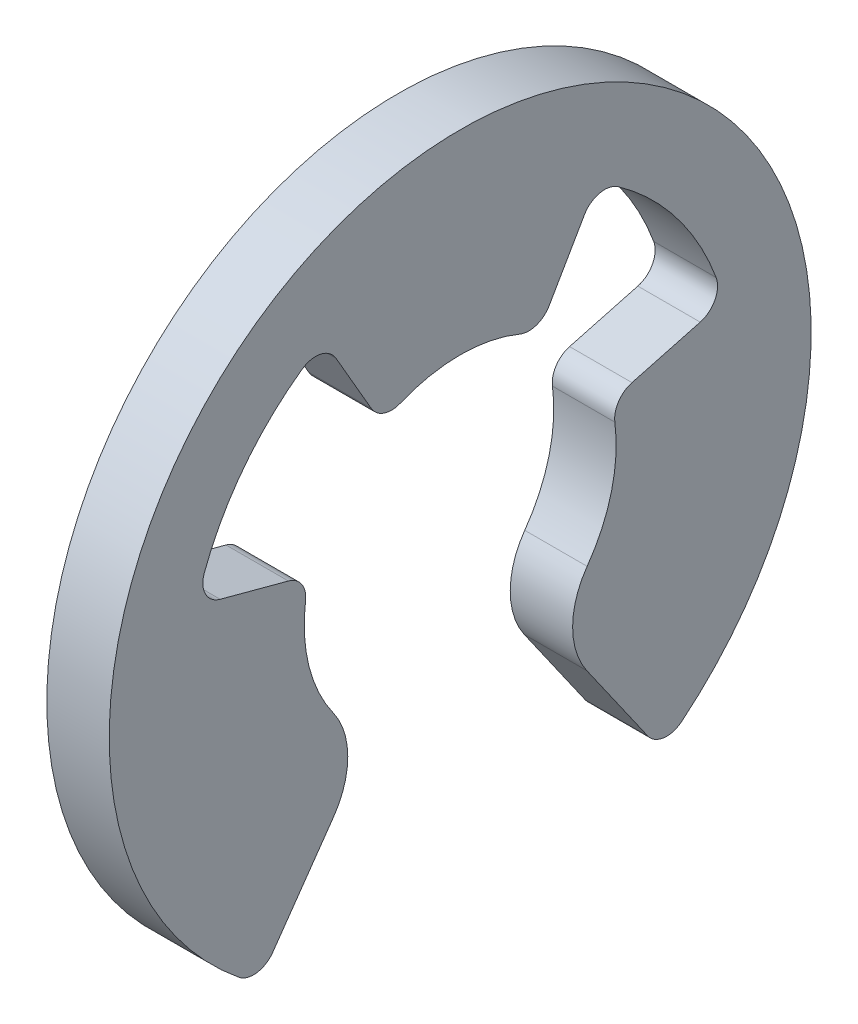
ISO-10303-21;
HEADER;
FILE_DESCRIPTION(('STEP AP214'),'2;1');
FILE_NAME('part.step','',(''),(''),'','','');
FILE_SCHEMA(('AUTOMOTIVE_DESIGN { 1 0 10303 214 1 1 1 1 }'));
ENDSEC;
DATA;
#1=APPLICATION_CONTEXT('core data for automotive mechanical design processes');
#2=APPLICATION_PROTOCOL_DEFINITION('international standard','automotive_design',2000,#1);
#3=PRODUCT_CONTEXT('',#1,'mechanical');
#4=PRODUCT('Part','Part','',(#3));
#5=PRODUCT_RELATED_PRODUCT_CATEGORY('part','',(#4));
#6=PRODUCT_DEFINITION_FORMATION('','',#4);
#7=PRODUCT_DEFINITION_CONTEXT('part definition',#1,'design');
#8=PRODUCT_DEFINITION('design','',#6,#7);
#9=PRODUCT_DEFINITION_SHAPE('','',#8);
#10=(LENGTH_UNIT() NAMED_UNIT(*) SI_UNIT(.MILLI.,.METRE.));
#11=(NAMED_UNIT(*) PLANE_ANGLE_UNIT() SI_UNIT($,.RADIAN.));
#12=(NAMED_UNIT(*) SI_UNIT($,.STERADIAN.) SOLID_ANGLE_UNIT());
#13=UNCERTAINTY_MEASURE_WITH_UNIT(LENGTH_MEASURE(1.E-05),#10,'distance_accuracy_value','');
#14=(GEOMETRIC_REPRESENTATION_CONTEXT(3) GLOBAL_UNCERTAINTY_ASSIGNED_CONTEXT((#13)) GLOBAL_UNIT_ASSIGNED_CONTEXT((#10,
#11,#12)) REPRESENTATION_CONTEXT('',''));
#15=CARTESIAN_POINT('',(0.,0.,0.));
#16=DIRECTION('',(0.,0.,1.));
#17=DIRECTION('',(1.,0.,0.));
#18=AXIS2_PLACEMENT_3D('',#15,#16,#17);
#19=CARTESIAN_POINT('',(0.8,-1.74333542500724,-2.44147119497954));
#20=DIRECTION('',(-1.,0.,0.));
#21=DIRECTION('',(0.,0.,1.));
#22=AXIS2_PLACEMENT_3D('',#19,#20,#21);
#23=CYLINDRICAL_SURFACE('',#22,1.);
#24=CARTESIAN_POINT('',(0.,-1.74333542500724,-2.44147119497954));
#25=DIRECTION('',(1.,0.,0.));
#26=DIRECTION('',(0.,0.,-1.));
#27=AXIS2_PLACEMENT_3D('',#24,#25,#26);
#28=CIRCLE('',#27,1.);
#29=CARTESIAN_POINT('',(0.,-1.1622236166715,-1.62764746331969));
#30=VERTEX_POINT('',#29);
#31=CARTESIAN_POINT('',(0.,-2.31691186135829,-1.62231915069054));
#32=VERTEX_POINT('',#31);
#33=EDGE_CURVE('E236',#30,#32,#28,.T.);
#34=ORIENTED_EDGE('',*,*,#33,.T.);
#35=DIRECTION('',(-1.,0.,0.));
#36=VECTOR('',#35,1.);
#37=CARTESIAN_POINT('',(0.8,-2.31691186135829,-1.62231915069054));
#38=LINE('',#37,#36);
#39=CARTESIAN_POINT('',(0.8,-2.31691186135829,-1.62231915069054));
#40=VERTEX_POINT('',#39);
#41=EDGE_CURVE('E11',#40,#32,#38,.T.);
#42=ORIENTED_EDGE('',*,*,#41,.F.);
#43=CARTESIAN_POINT('',(0.8,-1.74333542500724,-2.44147119497954));
#44=DIRECTION('',(1.,0.,0.));
#45=DIRECTION('',(0.,0.,-1.));
#46=AXIS2_PLACEMENT_3D('',#43,#44,#45);
#47=CIRCLE('',#46,1.);
#48=CARTESIAN_POINT('',(0.8,-1.1622236166715,-1.62764746331969));
#49=VERTEX_POINT('',#48);
#50=EDGE_CURVE('E306',#49,#40,#47,.T.);
#51=ORIENTED_EDGE('',*,*,#50,.F.);
#52=DIRECTION('',(-1.,0.,0.));
#53=VECTOR('',#52,1.);
#54=CARTESIAN_POINT('',(0.8,-1.1622236166715,-1.62764746331969));
#55=LINE('',#54,#53);
#56=EDGE_CURVE('E232',#49,#30,#55,.T.);
#57=ORIENTED_EDGE('',*,*,#56,.T.);
#58=EDGE_LOOP('',(#34,#42,#51,#57));
#59=FACE_BOUND('',#58,.T.);
#60=ADVANCED_FACE('F39',(#59),#23,.T.);
#61=CARTESIAN_POINT('',(0.8,-2.31691186135829,-1.62231915069054));
#62=DIRECTION('',(0.,0.573576436351042,-0.819152044288995));
#63=DIRECTION('',(0.,0.819152044288995,0.573576436351042));
#64=AXIS2_PLACEMENT_3D('',#61,#62,#63);
#65=PLANE('',#64);
#66=DIRECTION('',(0.,-0.819152044288995,-0.573576436351042));
#67=VECTOR('',#66,1.);
#68=CARTESIAN_POINT('',(0.,-2.31691186135829,-1.62231915069054));
#69=LINE('',#68,#67);
#70=CARTESIAN_POINT('',(0.,-3.43165073363867,-2.40286771219665));
#71=VERTEX_POINT('',#70);
#72=EDGE_CURVE('E240',#32,#71,#69,.T.);
#73=ORIENTED_EDGE('',*,*,#72,.T.);
#74=DIRECTION('',(-1.,0.,0.));
#75=VECTOR('',#74,1.);
#76=CARTESIAN_POINT('',(0.8,-3.43165073363867,-2.40286771219665));
#77=LINE('',#76,#75);
#78=CARTESIAN_POINT('',(0.8,-3.43165073363867,-2.40286771219665));
#79=VERTEX_POINT('',#78);
#80=EDGE_CURVE('E48',#79,#71,#77,.T.);
#81=ORIENTED_EDGE('',*,*,#80,.F.);
#82=DIRECTION('',(0.,-0.819152044288995,-0.573576436351042));
#83=VECTOR('',#82,1.);
#84=CARTESIAN_POINT('',(0.8,-2.31691186135829,-1.62231915069054));
#85=LINE('',#84,#83);
#86=EDGE_CURVE('E147',#40,#79,#85,.T.);
#87=ORIENTED_EDGE('',*,*,#86,.F.);
#88=ORIENTED_EDGE('',*,*,#41,.T.);
#89=EDGE_LOOP('',(#73,#81,#87,#88));
#90=FACE_BOUND('',#89,.T.);
#91=ADVANCED_FACE('F484',(#90),#65,.F.);
#92=CARTESIAN_POINT('',(0.8,-3.25957780273336,-2.64861332548335));
#93=DIRECTION('',(-1.,0.,0.));
#94=DIRECTION('',(0.,0.,1.));
#95=AXIS2_PLACEMENT_3D('',#92,#93,#94);
#96=CYLINDRICAL_SURFACE('',#95,0.3);
#97=CARTESIAN_POINT('',(0.,-3.25957780273336,-2.64861332548335));
#98=DIRECTION('',(1.,0.,0.));
#99=DIRECTION('',(0.,0.,1.));
#100=AXIS2_PLACEMENT_3D('',#97,#98,#99);
#101=CIRCLE('',#100,0.3);
#102=CARTESIAN_POINT('',(0.,-3.49240478864288,-2.8377999915893));
#103=VERTEX_POINT('',#102);
#104=EDGE_CURVE('E243',#71,#103,#101,.T.);
#105=ORIENTED_EDGE('',*,*,#104,.T.);
#106=DIRECTION('',(-1.,0.,0.));
#107=VECTOR('',#106,1.);
#108=CARTESIAN_POINT('',(0.8,-3.49240478864288,-2.8377999915893));
#109=LINE('',#108,#107);
#110=CARTESIAN_POINT('',(0.8,-3.49240478864288,-2.8377999915893));
#111=VERTEX_POINT('',#110);
#112=EDGE_CURVE('E381',#111,#103,#109,.T.);
#113=ORIENTED_EDGE('',*,*,#112,.F.);
#114=CARTESIAN_POINT('',(0.8,-3.25957780273336,-2.64861332548335));
#115=DIRECTION('',(1.,0.,0.));
#116=DIRECTION('',(0.,0.,1.));
#117=AXIS2_PLACEMENT_3D('',#114,#115,#116);
#118=CIRCLE('',#117,0.3);
#119=EDGE_CURVE('E391',#79,#111,#118,.T.);
#120=ORIENTED_EDGE('',*,*,#119,.F.);
#121=ORIENTED_EDGE('',*,*,#80,.T.);
#122=EDGE_LOOP('',(#105,#113,#120,#121));
#123=FACE_BOUND('',#122,.T.);
#124=ADVANCED_FACE('F389',(#123),#96,.T.);
#125=CARTESIAN_POINT('',(0.8,0.,0.));
#126=DIRECTION('',(-1.,0.,0.));
#127=DIRECTION('',(0.,0.,1.));
#128=AXIS2_PLACEMENT_3D('',#125,#126,#127);
#129=CYLINDRICAL_SURFACE('',#128,4.5);
#130=CARTESIAN_POINT('',(0.,0.,0.));
#131=DIRECTION('',(1.,0.,0.));
#132=DIRECTION('',(0.,0.,-1.));
#133=AXIS2_PLACEMENT_3D('',#130,#131,#132);
#134=CIRCLE('',#133,4.5);
#135=CARTESIAN_POINT('',(0.,-3.49240478864288,2.8377999915893));
#136=VERTEX_POINT('',#135);
#137=EDGE_CURVE('E246',#103,#136,#134,.T.);
#138=ORIENTED_EDGE('',*,*,#137,.T.);
#139=DIRECTION('',(-1.,0.,0.));
#140=VECTOR('',#139,1.);
#141=CARTESIAN_POINT('',(0.8,-3.49240478864288,2.8377999915893));
#142=LINE('',#141,#140);
#143=CARTESIAN_POINT('',(0.8,-3.49240478864288,2.8377999915893));
#144=VERTEX_POINT('',#143);
#145=EDGE_CURVE('E377',#144,#136,#142,.T.);
#146=ORIENTED_EDGE('',*,*,#145,.F.);
#147=CARTESIAN_POINT('',(0.8,0.,0.));
#148=DIRECTION('',(1.,0.,0.));
#149=DIRECTION('',(0.,0.,-1.));
#150=AXIS2_PLACEMENT_3D('',#147,#148,#149);
#151=CIRCLE('',#150,4.5);
#152=EDGE_CURVE('E410',#111,#144,#151,.T.);
#153=ORIENTED_EDGE('',*,*,#152,.F.);
#154=ORIENTED_EDGE('',*,*,#112,.T.);
#155=EDGE_LOOP('',(#138,#146,#153,#154));
#156=FACE_BOUND('',#155,.T.);
#157=ADVANCED_FACE('F400',(#156),#129,.T.);
#158=CARTESIAN_POINT('',(0.8,-3.25957780273336,2.64861332548335));
#159=DIRECTION('',(-1.,0.,0.));
#160=DIRECTION('',(0.,0.,1.));
#161=AXIS2_PLACEMENT_3D('',#158,#159,#160);
#162=CYLINDRICAL_SURFACE('',#161,0.3);
#163=CARTESIAN_POINT('',(0.,-3.25957780273336,2.64861332548335));
#164=DIRECTION('',(1.,0.,0.));
#165=DIRECTION('',(0.,0.,-1.));
#166=AXIS2_PLACEMENT_3D('',#163,#164,#165);
#167=CIRCLE('',#166,0.3);
#168=CARTESIAN_POINT('',(0.,-3.43165073363867,2.40286771219665));
#169=VERTEX_POINT('',#168);
#170=EDGE_CURVE('E249',#136,#169,#167,.T.);
#171=ORIENTED_EDGE('',*,*,#170,.T.);
#172=DIRECTION('',(-1.,0.,0.));
#173=VECTOR('',#172,1.);
#174=CARTESIAN_POINT('',(0.8,-3.43165073363867,2.40286771219665));
#175=LINE('',#174,#173);
#176=CARTESIAN_POINT('',(0.8,-3.43165073363867,2.40286771219665));
#177=VERTEX_POINT('',#176);
#178=EDGE_CURVE('E373',#177,#169,#175,.T.);
#179=ORIENTED_EDGE('',*,*,#178,.F.);
#180=CARTESIAN_POINT('',(0.8,-3.25957780273336,2.64861332548335));
#181=DIRECTION('',(1.,0.,0.));
#182=DIRECTION('',(0.,0.,-1.));
#183=AXIS2_PLACEMENT_3D('',#180,#181,#182);
#184=CIRCLE('',#183,0.3);
#185=EDGE_CURVE('E406',#144,#177,#184,.T.);
#186=ORIENTED_EDGE('',*,*,#185,.F.);
#187=ORIENTED_EDGE('',*,*,#145,.T.);
#188=EDGE_LOOP('',(#171,#179,#186,#187));
#189=FACE_BOUND('',#188,.T.);
#190=ADVANCED_FACE('F404',(#189),#162,.T.);
#191=CARTESIAN_POINT('',(0.8,-2.31691186135829,1.62231915069054));
#192=DIRECTION('',(0.,0.573576436351042,0.819152044288995));
#193=DIRECTION('',(0.,-0.819152044288995,0.573576436351042));
#194=AXIS2_PLACEMENT_3D('',#191,#192,#193);
#195=PLANE('',#194);
#196=DIRECTION('',(0.,0.819152044288995,-0.573576436351042));
#197=VECTOR('',#196,1.);
#198=CARTESIAN_POINT('',(0.,-2.31691186135829,1.62231915069054));
#199=LINE('',#198,#197);
#200=CARTESIAN_POINT('',(0.,-2.31691186135829,1.62231915069054));
#201=VERTEX_POINT('',#200);
#202=EDGE_CURVE('E252',#169,#201,#199,.T.);
#203=ORIENTED_EDGE('',*,*,#202,.T.);
#204=DIRECTION('',(-1.,0.,0.));
#205=VECTOR('',#204,1.);
#206=CARTESIAN_POINT('',(0.8,-2.31691186135829,1.62231915069054));
#207=LINE('',#206,#205);
#208=CARTESIAN_POINT('',(0.8,-2.31691186135829,1.62231915069054));
#209=VERTEX_POINT('',#208);
#210=EDGE_CURVE('E369',#209,#201,#207,.T.);
#211=ORIENTED_EDGE('',*,*,#210,.F.);
#212=DIRECTION('',(0.,0.819152044288995,-0.573576436351042));
#213=VECTOR('',#212,1.);
#214=CARTESIAN_POINT('',(0.8,-2.31691186135829,1.62231915069054));
#215=LINE('',#214,#213);
#216=EDGE_CURVE('E409',#177,#209,#215,.T.);
#217=ORIENTED_EDGE('',*,*,#216,.F.);
#218=ORIENTED_EDGE('',*,*,#178,.T.);
#219=EDGE_LOOP('',(#203,#211,#217,#218));
#220=FACE_BOUND('',#219,.T.);
#221=ADVANCED_FACE('F497',(#220),#195,.F.);
#222=CARTESIAN_POINT('',(0.8,-1.74333542500724,2.44147119497954));
#223=DIRECTION('',(-1.,0.,0.));
#224=DIRECTION('',(0.,0.,1.));
#225=AXIS2_PLACEMENT_3D('',#222,#223,#224);
#226=CYLINDRICAL_SURFACE('',#225,1.);
#227=CARTESIAN_POINT('',(0.,-1.74333542500724,2.44147119497954));
#228=DIRECTION('',(1.,0.,0.));
#229=DIRECTION('',(0.,0.,-1.));
#230=AXIS2_PLACEMENT_3D('',#227,#228,#229);
#231=CIRCLE('',#230,1.);
#232=CARTESIAN_POINT('',(0.,-1.1622236166715,1.62764746331969));
#233=VERTEX_POINT('',#232);
#234=EDGE_CURVE('E255',#201,#233,#231,.T.);
#235=ORIENTED_EDGE('',*,*,#234,.T.);
#236=DIRECTION('',(-1.,0.,0.));
#237=VECTOR('',#236,1.);
#238=CARTESIAN_POINT('',(0.8,-1.1622236166715,1.62764746331969));
#239=LINE('',#238,#237);
#240=CARTESIAN_POINT('',(0.8,-1.1622236166715,1.62764746331969));
#241=VERTEX_POINT('',#240);
#242=EDGE_CURVE('E365',#241,#233,#239,.T.);
#243=ORIENTED_EDGE('',*,*,#242,.F.);
#244=CARTESIAN_POINT('',(0.8,-1.74333542500724,2.44147119497954));
#245=DIRECTION('',(1.,0.,0.));
#246=DIRECTION('',(0.,0.,-1.));
#247=AXIS2_PLACEMENT_3D('',#244,#245,#246);
#248=CIRCLE('',#247,1.);
#249=EDGE_CURVE('E414',#209,#241,#248,.T.);
#250=ORIENTED_EDGE('',*,*,#249,.F.);
#251=ORIENTED_EDGE('',*,*,#210,.T.);
#252=EDGE_LOOP('',(#235,#243,#250,#251));
#253=FACE_BOUND('',#252,.T.);
#254=ADVANCED_FACE('F500',(#253),#226,.T.);
#255=CARTESIAN_POINT('',(0.8,0.,0.));
#256=DIRECTION('',(-1.,0.,0.));
#257=DIRECTION('',(0.,0.,1.));
#258=AXIS2_PLACEMENT_3D('',#255,#256,#257);
#259=CYLINDRICAL_SURFACE('',#258,2.);
#260=CARTESIAN_POINT('',(0.,0.,0.));
#261=DIRECTION('',(-1.,0.,0.));
#262=DIRECTION('',(0.,0.,-1.));
#263=AXIS2_PLACEMENT_3D('',#260,#261,#262);
#264=CIRCLE('',#263,2.);
#265=CARTESIAN_POINT('',(0.,0.261235201443749,1.9828656458587));
#266=VERTEX_POINT('',#265);
#267=EDGE_CURVE('E258',#233,#266,#264,.T.);
#268=ORIENTED_EDGE('',*,*,#267,.T.);
#269=DIRECTION('',(-1.,0.,0.));
#270=VECTOR('',#269,1.);
#271=CARTESIAN_POINT('',(0.8,0.261235201443749,1.9828656458587));
#272=LINE('',#271,#270);
#273=CARTESIAN_POINT('',(0.8,0.261235201443749,1.9828656458587));
#274=VERTEX_POINT('',#273);
#275=EDGE_CURVE('E361',#274,#266,#272,.T.);
#276=ORIENTED_EDGE('',*,*,#275,.F.);
#277=CARTESIAN_POINT('',(0.8,0.,0.));
#278=DIRECTION('',(-1.,0.,0.));
#279=DIRECTION('',(0.,0.,-1.));
#280=AXIS2_PLACEMENT_3D('',#277,#278,#279);
#281=CIRCLE('',#280,2.);
#282=EDGE_CURVE('E421',#241,#274,#281,.T.);
#283=ORIENTED_EDGE('',*,*,#282,.F.);
#284=ORIENTED_EDGE('',*,*,#242,.T.);
#285=EDGE_LOOP('',(#268,#276,#283,#284));
#286=FACE_BOUND('',#285,.T.);
#287=ADVANCED_FACE('F504',(#286),#259,.F.);
#288=CARTESIAN_POINT('',(0.8,0.300420481660312,2.28029549273751));
#289=DIRECTION('',(-1.,0.,0.));
#290=DIRECTION('',(0.,0.,1.));
#291=AXIS2_PLACEMENT_3D('',#288,#289,#290);
#292=CYLINDRICAL_SURFACE('',#291,0.3);
#293=CARTESIAN_POINT('',(0.,0.300420481660312,2.28029549273751));
#294=DIRECTION('',(1.,0.,0.));
#295=DIRECTION('',(0.,0.,-1.));
#296=AXIS2_PLACEMENT_3D('',#293,#294,#295);
#297=CIRCLE('',#296,0.3);
#298=CARTESIAN_POINT('',(0.,0.590198229547032,2.20264977920675));
#299=VERTEX_POINT('',#298);
#300=EDGE_CURVE('E261',#266,#299,#297,.T.);
#301=ORIENTED_EDGE('',*,*,#300,.T.);
#302=DIRECTION('',(-1.,0.,0.));
#303=VECTOR('',#302,1.);
#304=CARTESIAN_POINT('',(0.8,0.590198229547032,2.20264977920675));
#305=LINE('',#304,#303);
#306=CARTESIAN_POINT('',(0.8,0.590198229547032,2.20264977920675));
#307=VERTEX_POINT('',#306);
#308=EDGE_CURVE('E357',#307,#299,#305,.T.);
#309=ORIENTED_EDGE('',*,*,#308,.F.);
#310=CARTESIAN_POINT('',(0.8,0.300420481660312,2.28029549273751));
#311=DIRECTION('',(1.,0.,0.));
#312=DIRECTION('',(0.,0.,-1.));
#313=AXIS2_PLACEMENT_3D('',#310,#311,#312);
#314=CIRCLE('',#313,0.3);
#315=EDGE_CURVE('E424',#274,#307,#314,.T.);
#316=ORIENTED_EDGE('',*,*,#315,.F.);
#317=ORIENTED_EDGE('',*,*,#275,.T.);
#318=EDGE_LOOP('',(#301,#309,#316,#317));
#319=FACE_BOUND('',#318,.T.);
#320=ADVANCED_FACE('F508',(#319),#292,.T.);
#321=CARTESIAN_POINT('',(0.8,0.590198229547032,2.20264977920675));
#322=DIRECTION('',(0.,-0.965925826289069,0.258819045102518));
#323=DIRECTION('',(0.,-0.258819045102518,-0.965925826289069));
#324=AXIS2_PLACEMENT_3D('',#321,#322,#323);
#325=PLANE('',#324);
#326=DIRECTION('',(0.,0.258819045102518,0.965925826289069));
#327=VECTOR('',#326,1.);
#328=CARTESIAN_POINT('',(0.,0.590198229547032,2.20264977920675));
#329=LINE('',#328,#327);
#330=CARTESIAN_POINT('',(0.,0.824573268905777,3.07734933411955));
#331=VERTEX_POINT('',#330);
#332=EDGE_CURVE('E264',#299,#331,#329,.T.);
#333=ORIENTED_EDGE('',*,*,#332,.T.);
#334=DIRECTION('',(-1.,0.,0.));
#335=VECTOR('',#334,1.);
#336=CARTESIAN_POINT('',(0.8,0.824573268905777,3.07734933411955));
#337=LINE('',#336,#335);
#338=CARTESIAN_POINT('',(0.8,0.824573268905777,3.07734933411955));
#339=VERTEX_POINT('',#338);
#340=EDGE_CURVE('E353',#339,#331,#337,.T.);
#341=ORIENTED_EDGE('',*,*,#340,.F.);
#342=DIRECTION('',(0.,0.258819045102518,0.965925826289069));
#343=VECTOR('',#342,1.);
#344=CARTESIAN_POINT('',(0.8,0.590198229547032,2.20264977920675));
#345=LINE('',#344,#343);
#346=EDGE_CURVE('E427',#307,#339,#345,.T.);
#347=ORIENTED_EDGE('',*,*,#346,.F.);
#348=ORIENTED_EDGE('',*,*,#308,.T.);
#349=EDGE_LOOP('',(#333,#341,#347,#348));
#350=FACE_BOUND('',#349,.T.);
#351=ADVANCED_FACE('F512',(#350),#325,.F.);
#352=CARTESIAN_POINT('',(0.8,1.1143510167925,2.9997036205888));
#353=DIRECTION('',(-1.,0.,0.));
#354=DIRECTION('',(0.,0.,1.));
#355=AXIS2_PLACEMENT_3D('',#352,#353,#354);
#356=CYLINDRICAL_SURFACE('',#355,0.3);
#357=CARTESIAN_POINT('',(0.,1.1143510167925,2.9997036205888));
#358=DIRECTION('',(-1.,0.,0.));
#359=DIRECTION('',(0.,0.,1.));
#360=AXIS2_PLACEMENT_3D('',#357,#358,#359);
#361=CIRCLE('',#360,0.3);
#362=CARTESIAN_POINT('',(0.,1.21882142461679,3.280925835019));
#363=VERTEX_POINT('',#362);
#364=EDGE_CURVE('E267',#331,#363,#361,.T.);
#365=ORIENTED_EDGE('',*,*,#364,.T.);
#366=DIRECTION('',(-1.,0.,0.));
#367=VECTOR('',#366,1.);
#368=CARTESIAN_POINT('',(0.8,1.21882142461679,3.280925835019));
#369=LINE('',#368,#367);
#370=CARTESIAN_POINT('',(0.8,1.21882142461679,3.280925835019));
#371=VERTEX_POINT('',#370);
#372=EDGE_CURVE('E349',#371,#363,#369,.T.);
#373=ORIENTED_EDGE('',*,*,#372,.F.);
#374=CARTESIAN_POINT('',(0.8,1.1143510167925,2.9997036205888));
#375=DIRECTION('',(-1.,0.,0.));
#376=DIRECTION('',(0.,0.,1.));
#377=AXIS2_PLACEMENT_3D('',#374,#375,#376);
#378=CIRCLE('',#377,0.3);
#379=EDGE_CURVE('E430',#339,#371,#378,.T.);
#380=ORIENTED_EDGE('',*,*,#379,.F.);
#381=ORIENTED_EDGE('',*,*,#340,.T.);
#382=EDGE_LOOP('',(#365,#373,#380,#381));
#383=FACE_BOUND('',#382,.T.);
#384=ADVANCED_FACE('F516',(#383),#356,.F.);
#385=CARTESIAN_POINT('',(0.8,0.,0.));
#386=DIRECTION('',(-1.,0.,0.));
#387=DIRECTION('',(0.,0.,1.));
#388=AXIS2_PLACEMENT_3D('',#385,#386,#387);
#389=CYLINDRICAL_SURFACE('',#388,3.5);
#390=CARTESIAN_POINT('',(0.,0.,0.));
#391=DIRECTION('',(-1.,0.,0.));
#392=DIRECTION('',(0.,0.,-1.));
#393=AXIS2_PLACEMENT_3D('',#390,#391,#392);
#394=CIRCLE('',#393,3.5);
#395=CARTESIAN_POINT('',(0.,2.85367680091405,2.02645718334362));
#396=VERTEX_POINT('',#395);
#397=EDGE_CURVE('E270',#363,#396,#394,.T.);
#398=ORIENTED_EDGE('',*,*,#397,.T.);
#399=DIRECTION('',(-1.,0.,0.));
#400=VECTOR('',#399,1.);
#401=CARTESIAN_POINT('',(0.8,2.85367680091405,2.02645718334362));
#402=LINE('',#401,#400);
#403=CARTESIAN_POINT('',(0.8,2.85367680091405,2.02645718334362));
#404=VERTEX_POINT('',#403);
#405=EDGE_CURVE('E345',#404,#396,#402,.T.);
#406=ORIENTED_EDGE('',*,*,#405,.F.);
#407=CARTESIAN_POINT('',(0.8,0.,0.));
#408=DIRECTION('',(-1.,0.,0.));
#409=DIRECTION('',(0.,0.,-1.));
#410=AXIS2_PLACEMENT_3D('',#407,#408,#409);
#411=CIRCLE('',#410,3.5);
#412=EDGE_CURVE('E433',#371,#404,#411,.T.);
#413=ORIENTED_EDGE('',*,*,#412,.F.);
#414=ORIENTED_EDGE('',*,*,#372,.T.);
#415=EDGE_LOOP('',(#398,#406,#413,#414));
#416=FACE_BOUND('',#415,.T.);
#417=ADVANCED_FACE('F520',(#416),#389,.F.);
#418=CARTESIAN_POINT('',(0.8,2.60907593226428,1.85276085334274));
#419=DIRECTION('',(-1.,0.,0.));
#420=DIRECTION('',(0.,0.,1.));
#421=AXIS2_PLACEMENT_3D('',#418,#419,#420);
#422=CYLINDRICAL_SURFACE('',#421,0.3);
#423=CARTESIAN_POINT('',(0.,2.60907593226428,1.85276085334274));
#424=DIRECTION('',(-1.,0.,0.));
#425=DIRECTION('',(0.,0.,1.));
#426=AXIS2_PLACEMENT_3D('',#423,#424,#425);
#427=CIRCLE('',#426,0.3);
#428=CARTESIAN_POINT('',(0.,2.75907593226428,1.5929532322074));
#429=VERTEX_POINT('',#428);
#430=EDGE_CURVE('E273',#396,#429,#427,.T.);
#431=ORIENTED_EDGE('',*,*,#430,.T.);
#432=DIRECTION('',(-1.,0.,0.));
#433=VECTOR('',#432,1.);
#434=CARTESIAN_POINT('',(0.8,2.75907593226428,1.5929532322074));
#435=LINE('',#434,#433);
#436=CARTESIAN_POINT('',(0.8,2.75907593226428,1.5929532322074));
#437=VERTEX_POINT('',#436);
#438=EDGE_CURVE('E341',#437,#429,#435,.T.);
#439=ORIENTED_EDGE('',*,*,#438,.F.);
#440=CARTESIAN_POINT('',(0.8,2.60907593226428,1.85276085334274));
#441=DIRECTION('',(-1.,0.,0.));
#442=DIRECTION('',(0.,0.,1.));
#443=AXIS2_PLACEMENT_3D('',#440,#441,#442);
#444=CIRCLE('',#443,0.3);
#445=EDGE_CURVE('E436',#404,#437,#444,.T.);
#446=ORIENTED_EDGE('',*,*,#445,.F.);
#447=ORIENTED_EDGE('',*,*,#405,.T.);
#448=EDGE_LOOP('',(#431,#439,#446,#447));
#449=FACE_BOUND('',#448,.T.);
#450=ADVANCED_FACE('F524',(#449),#422,.F.);
#451=CARTESIAN_POINT('',(0.8,1.97484176581315,1.14017542509914));
#452=DIRECTION('',(0.,0.500000000000001,-0.866025403784438));
#453=DIRECTION('',(0.,0.866025403784438,0.500000000000001));
#454=AXIS2_PLACEMENT_3D('',#451,#452,#453);
#455=PLANE('',#454);
#456=DIRECTION('',(0.,-0.866025403784438,-0.500000000000001));
#457=VECTOR('',#456,1.);
#458=CARTESIAN_POINT('',(0.,1.97484176581315,1.14017542509914));
#459=LINE('',#458,#457);
#460=CARTESIAN_POINT('',(0.,1.97484176581315,1.14017542509914));
#461=VERTEX_POINT('',#460);
#462=EDGE_CURVE('E276',#429,#461,#459,.T.);
#463=ORIENTED_EDGE('',*,*,#462,.T.);
#464=DIRECTION('',(-1.,0.,0.));
#465=VECTOR('',#464,1.);
#466=CARTESIAN_POINT('',(0.8,1.97484176581315,1.14017542509914));
#467=LINE('',#466,#465);
#468=CARTESIAN_POINT('',(0.8,1.97484176581315,1.14017542509914));
#469=VERTEX_POINT('',#468);
#470=EDGE_CURVE('E337',#469,#461,#467,.T.);
#471=ORIENTED_EDGE('',*,*,#470,.F.);
#472=DIRECTION('',(0.,-0.866025403784438,-0.500000000000001));
#473=VECTOR('',#472,1.);
#474=CARTESIAN_POINT('',(0.8,1.97484176581315,1.14017542509914));
#475=LINE('',#474,#473);
#476=EDGE_CURVE('E439',#437,#469,#475,.T.);
#477=ORIENTED_EDGE('',*,*,#476,.F.);
#478=ORIENTED_EDGE('',*,*,#438,.T.);
#479=EDGE_LOOP('',(#463,#471,#477,#478));
#480=FACE_BOUND('',#479,.T.);
#481=ADVANCED_FACE('F528',(#480),#455,.F.);
#482=CARTESIAN_POINT('',(0.8,2.12484176581315,0.880367803963809));
#483=DIRECTION('',(-1.,0.,0.));
#484=DIRECTION('',(0.,0.,1.));
#485=AXIS2_PLACEMENT_3D('',#482,#483,#484);
#486=CYLINDRICAL_SURFACE('',#485,0.3);
#487=CARTESIAN_POINT('',(0.,2.12484176581315,0.880367803963809));
#488=DIRECTION('',(1.,0.,0.));
#489=DIRECTION('',(0.,0.,-1.));
#490=AXIS2_PLACEMENT_3D('',#487,#488,#489);
#491=CIRCLE('',#490,0.3);
#492=CARTESIAN_POINT('',(0.,1.84768849201143,0.765537220838095));
#493=VERTEX_POINT('',#492);
#494=EDGE_CURVE('E279',#461,#493,#491,.T.);
#495=ORIENTED_EDGE('',*,*,#494,.T.);
#496=DIRECTION('',(-1.,0.,0.));
#497=VECTOR('',#496,1.);
#498=CARTESIAN_POINT('',(0.8,1.84768849201143,0.765537220838095));
#499=LINE('',#498,#497);
#500=CARTESIAN_POINT('',(0.8,1.84768849201143,0.765537220838095));
#501=VERTEX_POINT('',#500);
#502=EDGE_CURVE('E333',#501,#493,#499,.T.);
#503=ORIENTED_EDGE('',*,*,#502,.F.);
#504=CARTESIAN_POINT('',(0.8,2.12484176581315,0.880367803963809));
#505=DIRECTION('',(1.,0.,0.));
#506=DIRECTION('',(0.,0.,-1.));
#507=AXIS2_PLACEMENT_3D('',#504,#505,#506);
#508=CIRCLE('',#507,0.3);
#509=EDGE_CURVE('E442',#469,#501,#508,.T.);
#510=ORIENTED_EDGE('',*,*,#509,.F.);
#511=ORIENTED_EDGE('',*,*,#470,.T.);
#512=EDGE_LOOP('',(#495,#503,#510,#511));
#513=FACE_BOUND('',#512,.T.);
#514=ADVANCED_FACE('F532',(#513),#486,.T.);
#515=CARTESIAN_POINT('',(0.8,0.,0.));
#516=DIRECTION('',(-1.,0.,0.));
#517=DIRECTION('',(0.,0.,1.));
#518=AXIS2_PLACEMENT_3D('',#515,#516,#517);
#519=CYLINDRICAL_SURFACE('',#518,2.);
#520=CARTESIAN_POINT('',(0.,0.,0.));
#521=DIRECTION('',(-1.,0.,0.));
#522=DIRECTION('',(0.,0.,-1.));
#523=AXIS2_PLACEMENT_3D('',#520,#521,#522);
#524=CIRCLE('',#523,2.);
#525=CARTESIAN_POINT('',(0.,1.84768849201143,-0.765537220838095));
#526=VERTEX_POINT('',#525);
#527=EDGE_CURVE('E282',#493,#526,#524,.T.);
#528=ORIENTED_EDGE('',*,*,#527,.T.);
#529=DIRECTION('',(-1.,0.,0.));
#530=VECTOR('',#529,1.);
#531=CARTESIAN_POINT('',(0.8,1.84768849201143,-0.765537220838095));
#532=LINE('',#531,#530);
#533=CARTESIAN_POINT('',(0.8,1.84768849201143,-0.765537220838095));
#534=VERTEX_POINT('',#533);
#535=EDGE_CURVE('E329',#534,#526,#532,.T.);
#536=ORIENTED_EDGE('',*,*,#535,.F.);
#537=CARTESIAN_POINT('',(0.8,0.,0.));
#538=DIRECTION('',(-1.,0.,0.));
#539=DIRECTION('',(0.,0.,-1.));
#540=AXIS2_PLACEMENT_3D('',#537,#538,#539);
#541=CIRCLE('',#540,2.);
#542=EDGE_CURVE('E445',#501,#534,#541,.T.);
#543=ORIENTED_EDGE('',*,*,#542,.F.);
#544=ORIENTED_EDGE('',*,*,#502,.T.);
#545=EDGE_LOOP('',(#528,#536,#543,#544));
#546=FACE_BOUND('',#545,.T.);
#547=ADVANCED_FACE('F536',(#546),#519,.F.);
#548=CARTESIAN_POINT('',(0.8,2.12484176581315,-0.880367803963809));
#549=DIRECTION('',(-1.,0.,0.));
#550=DIRECTION('',(0.,0.,1.));
#551=AXIS2_PLACEMENT_3D('',#548,#549,#550);
#552=CYLINDRICAL_SURFACE('',#551,0.3);
#553=CARTESIAN_POINT('',(0.,2.12484176581315,-0.880367803963809));
#554=DIRECTION('',(1.,0.,0.));
#555=DIRECTION('',(0.,0.,-1.));
#556=AXIS2_PLACEMENT_3D('',#553,#554,#555);
#557=CIRCLE('',#556,0.3);
#558=CARTESIAN_POINT('',(0.,1.97484176581315,-1.14017542509914));
#559=VERTEX_POINT('',#558);
#560=EDGE_CURVE('E285',#526,#559,#557,.T.);
#561=ORIENTED_EDGE('',*,*,#560,.T.);
#562=DIRECTION('',(-1.,0.,0.));
#563=VECTOR('',#562,1.);
#564=CARTESIAN_POINT('',(0.8,1.97484176581315,-1.14017542509914));
#565=LINE('',#564,#563);
#566=CARTESIAN_POINT('',(0.8,1.97484176581315,-1.14017542509914));
#567=VERTEX_POINT('',#566);
#568=EDGE_CURVE('E325',#567,#559,#565,.T.);
#569=ORIENTED_EDGE('',*,*,#568,.F.);
#570=CARTESIAN_POINT('',(0.8,2.12484176581315,-0.880367803963809));
#571=DIRECTION('',(1.,0.,0.));
#572=DIRECTION('',(0.,0.,-1.));
#573=AXIS2_PLACEMENT_3D('',#570,#571,#572);
#574=CIRCLE('',#573,0.3);
#575=EDGE_CURVE('E448',#534,#567,#574,.T.);
#576=ORIENTED_EDGE('',*,*,#575,.F.);
#577=ORIENTED_EDGE('',*,*,#535,.T.);
#578=EDGE_LOOP('',(#561,#569,#576,#577));
#579=FACE_BOUND('',#578,.T.);
#580=ADVANCED_FACE('F540',(#579),#552,.T.);
#581=CARTESIAN_POINT('',(0.8,1.97484176581315,-1.14017542509914));
#582=DIRECTION('',(0.,0.5,0.866025403784438));
#583=DIRECTION('',(0.,-0.866025403784439,0.5));
#584=AXIS2_PLACEMENT_3D('',#581,#582,#583);
#585=PLANE('',#584);
#586=DIRECTION('',(0.,0.866025403784439,-0.5));
#587=VECTOR('',#586,1.);
#588=CARTESIAN_POINT('',(0.,1.97484176581315,-1.14017542509914));
#589=LINE('',#588,#587);
#590=CARTESIAN_POINT('',(0.,2.75907593226428,-1.5929532322074));
#591=VERTEX_POINT('',#590);
#592=EDGE_CURVE('E288',#559,#591,#589,.T.);
#593=ORIENTED_EDGE('',*,*,#592,.T.);
#594=DIRECTION('',(-1.,0.,0.));
#595=VECTOR('',#594,1.);
#596=CARTESIAN_POINT('',(0.8,2.75907593226428,-1.5929532322074));
#597=LINE('',#596,#595);
#598=CARTESIAN_POINT('',(0.8,2.75907593226428,-1.5929532322074));
#599=VERTEX_POINT('',#598);
#600=EDGE_CURVE('E321',#599,#591,#597,.T.);
#601=ORIENTED_EDGE('',*,*,#600,.F.);
#602=DIRECTION('',(0.,0.866025403784439,-0.5));
#603=VECTOR('',#602,1.);
#604=CARTESIAN_POINT('',(0.8,1.97484176581315,-1.14017542509914));
#605=LINE('',#604,#603);
#606=EDGE_CURVE('E451',#567,#599,#605,.T.);
#607=ORIENTED_EDGE('',*,*,#606,.F.);
#608=ORIENTED_EDGE('',*,*,#568,.T.);
#609=EDGE_LOOP('',(#593,#601,#607,#608));
#610=FACE_BOUND('',#609,.T.);
#611=ADVANCED_FACE('F544',(#610),#585,.F.);
#612=CARTESIAN_POINT('',(0.8,2.60907593226428,-1.85276085334273));
#613=DIRECTION('',(-1.,0.,0.));
#614=DIRECTION('',(0.,0.,1.));
#615=AXIS2_PLACEMENT_3D('',#612,#613,#614);
#616=CYLINDRICAL_SURFACE('',#615,0.3);
#617=CARTESIAN_POINT('',(0.,2.60907593226428,-1.85276085334273));
#618=DIRECTION('',(-1.,0.,0.));
#619=DIRECTION('',(0.,0.,-1.));
#620=AXIS2_PLACEMENT_3D('',#617,#618,#619);
#621=CIRCLE('',#620,0.3);
#622=CARTESIAN_POINT('',(0.,2.85367680091405,-2.02645718334362));
#623=VERTEX_POINT('',#622);
#624=EDGE_CURVE('E291',#591,#623,#621,.T.);
#625=ORIENTED_EDGE('',*,*,#624,.T.);
#626=DIRECTION('',(-1.,0.,0.));
#627=VECTOR('',#626,1.);
#628=CARTESIAN_POINT('',(0.8,2.85367680091405,-2.02645718334362));
#629=LINE('',#628,#627);
#630=CARTESIAN_POINT('',(0.8,2.85367680091405,-2.02645718334362));
#631=VERTEX_POINT('',#630);
#632=EDGE_CURVE('E317',#631,#623,#629,.T.);
#633=ORIENTED_EDGE('',*,*,#632,.F.);
#634=CARTESIAN_POINT('',(0.8,2.60907593226428,-1.85276085334273));
#635=DIRECTION('',(-1.,0.,0.));
#636=DIRECTION('',(0.,0.,-1.));
#637=AXIS2_PLACEMENT_3D('',#634,#635,#636);
#638=CIRCLE('',#637,0.3);
#639=EDGE_CURVE('E454',#599,#631,#638,.T.);
#640=ORIENTED_EDGE('',*,*,#639,.F.);
#641=ORIENTED_EDGE('',*,*,#600,.T.);
#642=EDGE_LOOP('',(#625,#633,#640,#641));
#643=FACE_BOUND('',#642,.T.);
#644=ADVANCED_FACE('F548',(#643),#616,.F.);
#645=CARTESIAN_POINT('',(0.8,0.,0.));
#646=DIRECTION('',(-1.,0.,0.));
#647=DIRECTION('',(0.,0.,1.));
#648=AXIS2_PLACEMENT_3D('',#645,#646,#647);
#649=CYLINDRICAL_SURFACE('',#648,3.5);
#650=CARTESIAN_POINT('',(0.,0.,0.));
#651=DIRECTION('',(-1.,0.,0.));
#652=DIRECTION('',(0.,0.,-1.));
#653=AXIS2_PLACEMENT_3D('',#650,#651,#652);
#654=CIRCLE('',#653,3.5);
#655=CARTESIAN_POINT('',(0.,1.21882142461679,-3.280925835019));
#656=VERTEX_POINT('',#655);
#657=EDGE_CURVE('E294',#623,#656,#654,.T.);
#658=ORIENTED_EDGE('',*,*,#657,.T.);
#659=DIRECTION('',(-1.,0.,0.));
#660=VECTOR('',#659,1.);
#661=CARTESIAN_POINT('',(0.8,1.21882142461679,-3.280925835019));
#662=LINE('',#661,#660);
#663=CARTESIAN_POINT('',(0.8,1.21882142461679,-3.280925835019));
#664=VERTEX_POINT('',#663);
#665=EDGE_CURVE('E313',#664,#656,#662,.T.);
#666=ORIENTED_EDGE('',*,*,#665,.F.);
#667=CARTESIAN_POINT('',(0.8,0.,0.));
#668=DIRECTION('',(-1.,0.,0.));
#669=DIRECTION('',(0.,0.,-1.));
#670=AXIS2_PLACEMENT_3D('',#667,#668,#669);
#671=CIRCLE('',#670,3.5);
#672=EDGE_CURVE('E457',#631,#664,#671,.T.);
#673=ORIENTED_EDGE('',*,*,#672,.F.);
#674=ORIENTED_EDGE('',*,*,#632,.T.);
#675=EDGE_LOOP('',(#658,#666,#673,#674));
#676=FACE_BOUND('',#675,.T.);
#677=ADVANCED_FACE('F465',(#676),#649,.F.);
#678=CARTESIAN_POINT('',(0.8,1.1143510167925,-2.9997036205888));
#679=DIRECTION('',(-1.,0.,0.));
#680=DIRECTION('',(0.,0.,1.));
#681=AXIS2_PLACEMENT_3D('',#678,#679,#680);
#682=CYLINDRICAL_SURFACE('',#681,0.3);
#683=CARTESIAN_POINT('',(0.,1.1143510167925,-2.9997036205888));
#684=DIRECTION('',(-1.,0.,0.));
#685=DIRECTION('',(0.,0.,1.));
#686=AXIS2_PLACEMENT_3D('',#683,#684,#685);
#687=CIRCLE('',#686,0.3);
#688=CARTESIAN_POINT('',(0.,0.824573268905777,-3.07734933411955));
#689=VERTEX_POINT('',#688);
#690=EDGE_CURVE('E297',#656,#689,#687,.T.);
#691=ORIENTED_EDGE('',*,*,#690,.T.);
#692=DIRECTION('',(-1.,0.,0.));
#693=VECTOR('',#692,1.);
#694=CARTESIAN_POINT('',(0.8,0.824573268905777,-3.07734933411955));
#695=LINE('',#694,#693);
#696=CARTESIAN_POINT('',(0.8,0.824573268905777,-3.07734933411955));
#697=VERTEX_POINT('',#696);
#698=EDGE_CURVE('E225',#697,#689,#695,.T.);
#699=ORIENTED_EDGE('',*,*,#698,.F.);
#700=CARTESIAN_POINT('',(0.8,1.1143510167925,-2.9997036205888));
#701=DIRECTION('',(-1.,0.,0.));
#702=DIRECTION('',(0.,0.,1.));
#703=AXIS2_PLACEMENT_3D('',#700,#701,#702);
#704=CIRCLE('',#703,0.3);
#705=EDGE_CURVE('E214',#664,#697,#704,.T.);
#706=ORIENTED_EDGE('',*,*,#705,.F.);
#707=ORIENTED_EDGE('',*,*,#665,.T.);
#708=EDGE_LOOP('',(#691,#699,#706,#707));
#709=FACE_BOUND('',#708,.T.);
#710=ADVANCED_FACE('F469',(#709),#682,.F.);
#711=CARTESIAN_POINT('',(0.8,0.590198229547032,-2.20264977920675));
#712=DIRECTION('',(0.,-0.965925826289069,-0.258819045102518));
#713=DIRECTION('',(0.,0.258819045102518,-0.965925826289069));
#714=AXIS2_PLACEMENT_3D('',#711,#712,#713);
#715=PLANE('',#714);
#716=DIRECTION('',(0.,-0.258819045102518,0.965925826289069));
#717=VECTOR('',#716,1.);
#718=CARTESIAN_POINT('',(0.,0.590198229547032,-2.20264977920675));
#719=LINE('',#718,#717);
#720=CARTESIAN_POINT('',(0.,0.590198229547032,-2.20264977920675));
#721=VERTEX_POINT('',#720);
#722=EDGE_CURVE('E223',#689,#721,#719,.T.);
#723=ORIENTED_EDGE('',*,*,#722,.T.);
#724=DIRECTION('',(-1.,0.,0.));
#725=VECTOR('',#724,1.);
#726=CARTESIAN_POINT('',(0.8,0.590198229547032,-2.20264977920675));
#727=LINE('',#726,#725);
#728=CARTESIAN_POINT('',(0.8,0.590198229547032,-2.20264977920675));
#729=VERTEX_POINT('',#728);
#730=EDGE_CURVE('E220',#729,#721,#727,.T.);
#731=ORIENTED_EDGE('',*,*,#730,.F.);
#732=DIRECTION('',(0.,-0.258819045102518,0.965925826289069));
#733=VECTOR('',#732,1.);
#734=CARTESIAN_POINT('',(0.8,0.590198229547032,-2.20264977920675));
#735=LINE('',#734,#733);
#736=EDGE_CURVE('E208',#697,#729,#735,.T.);
#737=ORIENTED_EDGE('',*,*,#736,.F.);
#738=ORIENTED_EDGE('',*,*,#698,.T.);
#739=EDGE_LOOP('',(#723,#731,#737,#738));
#740=FACE_BOUND('',#739,.T.);
#741=ADVANCED_FACE('F221',(#740),#715,.F.);
#742=CARTESIAN_POINT('',(0.8,0.300420481660311,-2.28029549273751));
#743=DIRECTION('',(-1.,0.,0.));
#744=DIRECTION('',(0.,0.,1.));
#745=AXIS2_PLACEMENT_3D('',#742,#743,#744);
#746=CYLINDRICAL_SURFACE('',#745,0.3);
#747=CARTESIAN_POINT('',(0.,0.300420481660311,-2.28029549273751));
#748=DIRECTION('',(1.,0.,0.));
#749=DIRECTION('',(0.,0.,1.));
#750=AXIS2_PLACEMENT_3D('',#747,#748,#749);
#751=CIRCLE('',#750,0.3);
#752=CARTESIAN_POINT('',(0.,0.261235201443748,-1.9828656458587));
#753=VERTEX_POINT('',#752);
#754=EDGE_CURVE('E133',#721,#753,#751,.T.);
#755=ORIENTED_EDGE('',*,*,#754,.T.);
#756=DIRECTION('',(-1.,0.,0.));
#757=VECTOR('',#756,1.);
#758=CARTESIAN_POINT('',(0.8,0.261235201443748,-1.9828656458587));
#759=LINE('',#758,#757);
#760=CARTESIAN_POINT('',(0.8,0.261235201443748,-1.9828656458587));
#761=VERTEX_POINT('',#760);
#762=EDGE_CURVE('E226',#761,#753,#759,.T.);
#763=ORIENTED_EDGE('',*,*,#762,.F.);
#764=CARTESIAN_POINT('',(0.8,0.300420481660311,-2.28029549273751));
#765=DIRECTION('',(1.,0.,0.));
#766=DIRECTION('',(0.,0.,1.));
#767=AXIS2_PLACEMENT_3D('',#764,#765,#766);
#768=CIRCLE('',#767,0.3);
#769=EDGE_CURVE('E212',#729,#761,#768,.T.);
#770=ORIENTED_EDGE('',*,*,#769,.F.);
#771=ORIENTED_EDGE('',*,*,#730,.T.);
#772=EDGE_LOOP('',(#755,#763,#770,#771));
#773=FACE_BOUND('',#772,.T.);
#774=ADVANCED_FACE('F228',(#773),#746,.T.);
#775=CARTESIAN_POINT('',(0.8,0.,0.));
#776=DIRECTION('',(-1.,0.,0.));
#777=DIRECTION('',(0.,0.,1.));
#778=AXIS2_PLACEMENT_3D('',#775,#776,#777);
#779=CYLINDRICAL_SURFACE('',#778,2.);
#780=CARTESIAN_POINT('',(0.,0.,0.));
#781=DIRECTION('',(-1.,0.,0.));
#782=DIRECTION('',(0.,0.,-1.));
#783=AXIS2_PLACEMENT_3D('',#780,#781,#782);
#784=CIRCLE('',#783,2.);
#785=EDGE_CURVE('E139',#753,#30,#784,.T.);
#786=ORIENTED_EDGE('',*,*,#785,.T.);
#787=ORIENTED_EDGE('',*,*,#56,.F.);
#788=CARTESIAN_POINT('',(0.8,0.,0.));
#789=DIRECTION('',(-1.,0.,0.));
#790=DIRECTION('',(0.,0.,-1.));
#791=AXIS2_PLACEMENT_3D('',#788,#789,#790);
#792=CIRCLE('',#791,2.);
#793=EDGE_CURVE('E56',#761,#49,#792,.T.);
#794=ORIENTED_EDGE('',*,*,#793,.F.);
#795=ORIENTED_EDGE('',*,*,#762,.T.);
#796=EDGE_LOOP('',(#786,#787,#794,#795));
#797=FACE_BOUND('',#796,.T.);
#798=ADVANCED_FACE('F473',(#797),#779,.F.);
#799=CARTESIAN_POINT('',(0.8,-1.74333542500724,-2.44147119497954));
#800=DIRECTION('',(1.,0.,0.));
#801=DIRECTION('',(0.,0.,-1.));
#802=AXIS2_PLACEMENT_3D('',#799,#800,#801);
#803=PLANE('',#802);
#804=ORIENTED_EDGE('',*,*,#50,.T.);
#805=ORIENTED_EDGE('',*,*,#86,.T.);
#806=ORIENTED_EDGE('',*,*,#119,.T.);
#807=ORIENTED_EDGE('',*,*,#152,.T.);
#808=ORIENTED_EDGE('',*,*,#185,.T.);
#809=ORIENTED_EDGE('',*,*,#216,.T.);
#810=ORIENTED_EDGE('',*,*,#249,.T.);
#811=ORIENTED_EDGE('',*,*,#282,.T.);
#812=ORIENTED_EDGE('',*,*,#315,.T.);
#813=ORIENTED_EDGE('',*,*,#346,.T.);
#814=ORIENTED_EDGE('',*,*,#379,.T.);
#815=ORIENTED_EDGE('',*,*,#412,.T.);
#816=ORIENTED_EDGE('',*,*,#445,.T.);
#817=ORIENTED_EDGE('',*,*,#476,.T.);
#818=ORIENTED_EDGE('',*,*,#509,.T.);
#819=ORIENTED_EDGE('',*,*,#542,.T.);
#820=ORIENTED_EDGE('',*,*,#575,.T.);
#821=ORIENTED_EDGE('',*,*,#606,.T.);
#822=ORIENTED_EDGE('',*,*,#639,.T.);
#823=ORIENTED_EDGE('',*,*,#672,.T.);
#824=ORIENTED_EDGE('',*,*,#705,.T.);
#825=ORIENTED_EDGE('',*,*,#736,.T.);
#826=ORIENTED_EDGE('',*,*,#769,.T.);
#827=ORIENTED_EDGE('',*,*,#793,.T.);
#828=EDGE_LOOP('',(#804,#805,#806,#807,#808,#809,#810,#811,#812,#813,#814,#815,#816,#817,#818,
#819,#820,#821,#822,#823,#824,#825,#826,#827));
#829=FACE_BOUND('',#828,.T.);
#830=ADVANCED_FACE('F210',(#829),#803,.T.);
#831=CARTESIAN_POINT('',(0.,-1.74333542500724,-2.44147119497954));
#832=DIRECTION('',(1.,0.,0.));
#833=DIRECTION('',(0.,0.,-1.));
#834=AXIS2_PLACEMENT_3D('',#831,#832,#833);
#835=PLANE('',#834);
#836=ORIENTED_EDGE('',*,*,#33,.F.);
#837=ORIENTED_EDGE('',*,*,#785,.F.);
#838=ORIENTED_EDGE('',*,*,#754,.F.);
#839=ORIENTED_EDGE('',*,*,#722,.F.);
#840=ORIENTED_EDGE('',*,*,#690,.F.);
#841=ORIENTED_EDGE('',*,*,#657,.F.);
#842=ORIENTED_EDGE('',*,*,#624,.F.);
#843=ORIENTED_EDGE('',*,*,#592,.F.);
#844=ORIENTED_EDGE('',*,*,#560,.F.);
#845=ORIENTED_EDGE('',*,*,#527,.F.);
#846=ORIENTED_EDGE('',*,*,#494,.F.);
#847=ORIENTED_EDGE('',*,*,#462,.F.);
#848=ORIENTED_EDGE('',*,*,#430,.F.);
#849=ORIENTED_EDGE('',*,*,#397,.F.);
#850=ORIENTED_EDGE('',*,*,#364,.F.);
#851=ORIENTED_EDGE('',*,*,#332,.F.);
#852=ORIENTED_EDGE('',*,*,#300,.F.);
#853=ORIENTED_EDGE('',*,*,#267,.F.);
#854=ORIENTED_EDGE('',*,*,#234,.F.);
#855=ORIENTED_EDGE('',*,*,#202,.F.);
#856=ORIENTED_EDGE('',*,*,#170,.F.);
#857=ORIENTED_EDGE('',*,*,#137,.F.);
#858=ORIENTED_EDGE('',*,*,#104,.F.);
#859=ORIENTED_EDGE('',*,*,#72,.F.);
#860=EDGE_LOOP('',(#836,#837,#838,#839,#840,#841,#842,#843,#844,#845,#846,#847,#848,#849,#850,
#851,#852,#853,#854,#855,#856,#857,#858,#859));
#861=FACE_BOUND('',#860,.T.);
#862=ADVANCED_FACE('F395',(#861),#835,.F.);
#863=CLOSED_SHELL('',(#60,#91,#124,#157,#190,#221,#254,#287,#320,#351,#384,#417,#450,#481,#514,
#547,#580,#611,#644,#677,#710,#741,#774,#798,#830,#862));
#864=MANIFOLD_SOLID_BREP('B2',#863);
#865=ADVANCED_BREP_SHAPE_REPRESENTATION('',(#18,#864),#14);
#866=SHAPE_DEFINITION_REPRESENTATION(#9,#865);
ENDSEC;
END-ISO-10303-21;
